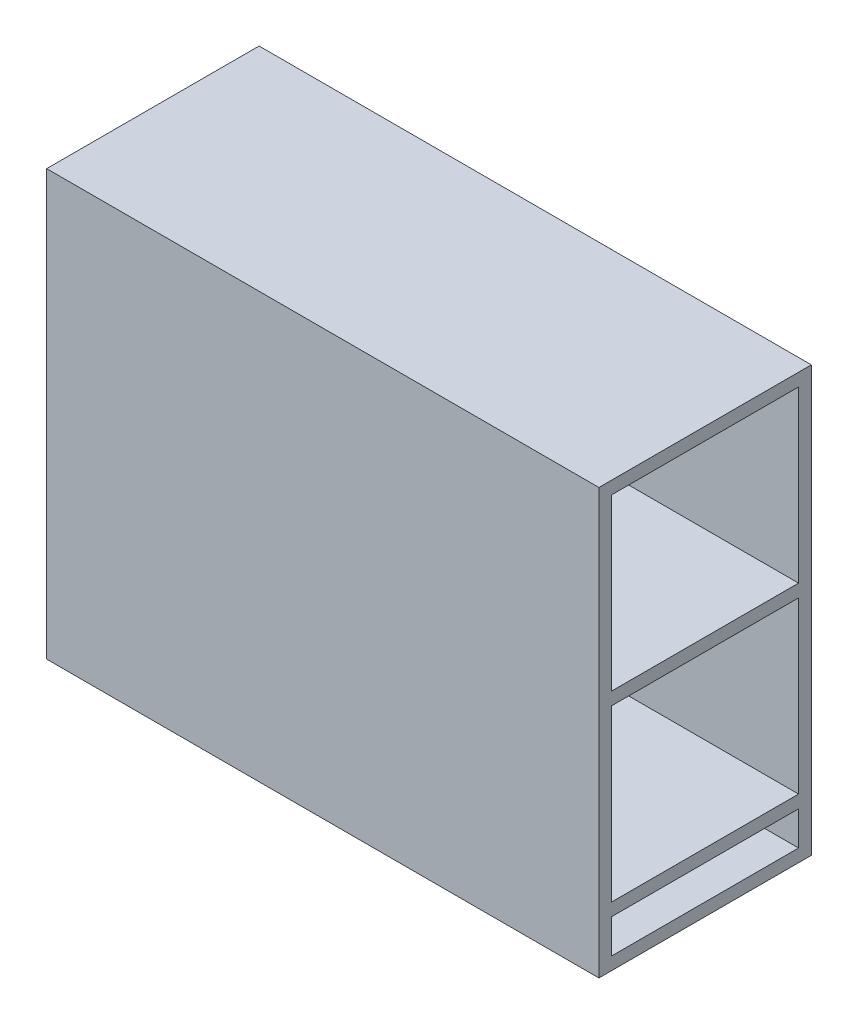
ISO-10303-21;
HEADER;
FILE_DESCRIPTION(('STEP AP214'),'2;1');
FILE_NAME('part.step','',(''),(''),'','','');
FILE_SCHEMA(('AUTOMOTIVE_DESIGN { 1 0 10303 214 1 1 1 1 }'));
ENDSEC;
DATA;
#1=APPLICATION_CONTEXT('core data for automotive mechanical design processes');
#2=APPLICATION_PROTOCOL_DEFINITION('international standard','automotive_design',2000,#1);
#3=PRODUCT_CONTEXT('',#1,'mechanical');
#4=PRODUCT('Part','Part','',(#3));
#5=PRODUCT_RELATED_PRODUCT_CATEGORY('part','',(#4));
#6=PRODUCT_DEFINITION_FORMATION('','',#4);
#7=PRODUCT_DEFINITION_CONTEXT('part definition',#1,'design');
#8=PRODUCT_DEFINITION('design','',#6,#7);
#9=PRODUCT_DEFINITION_SHAPE('','',#8);
#10=(LENGTH_UNIT() NAMED_UNIT(*) SI_UNIT(.MILLI.,.METRE.));
#11=(NAMED_UNIT(*) PLANE_ANGLE_UNIT() SI_UNIT($,.RADIAN.));
#12=(NAMED_UNIT(*) SI_UNIT($,.STERADIAN.) SOLID_ANGLE_UNIT());
#13=UNCERTAINTY_MEASURE_WITH_UNIT(LENGTH_MEASURE(1.E-05),#10,'distance_accuracy_value','');
#14=(GEOMETRIC_REPRESENTATION_CONTEXT(3) GLOBAL_UNCERTAINTY_ASSIGNED_CONTEXT((#13)) GLOBAL_UNIT_ASSIGNED_CONTEXT((#10,
#11,#12)) REPRESENTATION_CONTEXT('',''));
#15=CARTESIAN_POINT('',(0.,0.,0.));
#16=DIRECTION('',(0.,0.,1.));
#17=DIRECTION('',(1.,0.,0.));
#18=AXIS2_PLACEMENT_3D('',#15,#16,#17);
#19=CARTESIAN_POINT('',(0.,100.,0.));
#20=DIRECTION('',(1.,0.,0.));
#21=DIRECTION('',(0.,0.,-1.));
#22=AXIS2_PLACEMENT_3D('',#19,#20,#21);
#23=PLANE('',#22);
#24=DIRECTION('',(0.,0.,1.));
#25=VECTOR('',#24,1.);
#26=CARTESIAN_POINT('',(0.,0.,0.));
#27=LINE('',#26,#25);
#28=CARTESIAN_POINT('',(0.,0.,-50.));
#29=VERTEX_POINT('',#28);
#30=CARTESIAN_POINT('',(0.,0.,0.));
#31=VERTEX_POINT('',#30);
#32=EDGE_CURVE('E244',#29,#31,#27,.T.);
#33=ORIENTED_EDGE('',*,*,#32,.T.);
#34=DIRECTION('',(0.,-1.,0.));
#35=VECTOR('',#34,1.);
#36=CARTESIAN_POINT('',(0.,100.,0.));
#37=LINE('',#36,#35);
#38=CARTESIAN_POINT('',(0.,100.,0.));
#39=VERTEX_POINT('',#38);
#40=EDGE_CURVE('E12',#39,#31,#37,.T.);
#41=ORIENTED_EDGE('',*,*,#40,.F.);
#42=DIRECTION('',(0.,0.,1.));
#43=VECTOR('',#42,1.);
#44=CARTESIAN_POINT('',(0.,100.,0.));
#45=LINE('',#44,#43);
#46=CARTESIAN_POINT('',(0.,100.,-50.));
#47=VERTEX_POINT('',#46);
#48=EDGE_CURVE('E245',#47,#39,#45,.T.);
#49=ORIENTED_EDGE('',*,*,#48,.F.);
#50=DIRECTION('',(0.,-1.,0.));
#51=VECTOR('',#50,1.);
#52=CARTESIAN_POINT('',(0.,100.,-50.));
#53=LINE('',#52,#51);
#54=EDGE_CURVE('E255',#47,#29,#53,.T.);
#55=ORIENTED_EDGE('',*,*,#54,.T.);
#56=EDGE_LOOP('',(#33,#41,#49,#55));
#57=FACE_BOUND('',#56,.T.);
#58=ADVANCED_FACE('F39',(#57),#23,.F.);
#59=CARTESIAN_POINT('',(0.,100.,0.));
#60=DIRECTION('',(0.,0.,-1.));
#61=DIRECTION('',(-1.,0.,0.));
#62=AXIS2_PLACEMENT_3D('',#59,#60,#61);
#63=PLANE('',#62);
#64=DIRECTION('',(1.,0.,0.));
#65=VECTOR('',#64,1.);
#66=CARTESIAN_POINT('',(0.,0.,0.));
#67=LINE('',#66,#65);
#68=CARTESIAN_POINT('',(130.,0.,0.));
#69=VERTEX_POINT('',#68);
#70=EDGE_CURVE('E258',#31,#69,#67,.T.);
#71=ORIENTED_EDGE('',*,*,#70,.T.);
#72=DIRECTION('',(0.,-1.,0.));
#73=VECTOR('',#72,1.);
#74=CARTESIAN_POINT('',(130.,100.,0.));
#75=LINE('',#74,#73);
#76=CARTESIAN_POINT('',(130.,100.,0.));
#77=VERTEX_POINT('',#76);
#78=EDGE_CURVE('E46',#77,#69,#75,.T.);
#79=ORIENTED_EDGE('',*,*,#78,.F.);
#80=DIRECTION('',(1.,0.,0.));
#81=VECTOR('',#80,1.);
#82=CARTESIAN_POINT('',(0.,100.,0.));
#83=LINE('',#82,#81);
#84=EDGE_CURVE('E248',#39,#77,#83,.T.);
#85=ORIENTED_EDGE('',*,*,#84,.F.);
#86=ORIENTED_EDGE('',*,*,#40,.T.);
#87=EDGE_LOOP('',(#71,#79,#85,#86));
#88=FACE_BOUND('',#87,.T.);
#89=ADVANCED_FACE('F288',(#88),#63,.F.);
#90=CARTESIAN_POINT('',(130.,100.,0.));
#91=DIRECTION('',(-1.,0.,0.));
#92=DIRECTION('',(0.,0.,1.));
#93=AXIS2_PLACEMENT_3D('',#90,#91,#92);
#94=PLANE('',#93);
#95=DIRECTION('',(0.,0.,-1.));
#96=VECTOR('',#95,1.);
#97=CARTESIAN_POINT('',(130.,11.,-3.));
#98=LINE('',#97,#96);
#99=CARTESIAN_POINT('',(130.,11.,-3.));
#100=VERTEX_POINT('',#99);
#101=CARTESIAN_POINT('',(130.,11.,-47.));
#102=VERTEX_POINT('',#101);
#103=EDGE_CURVE('E173',#100,#102,#98,.T.);
#104=ORIENTED_EDGE('',*,*,#103,.T.);
#105=DIRECTION('',(0.,-1.,0.));
#106=VECTOR('',#105,1.);
#107=CARTESIAN_POINT('',(130.,100.,-47.));
#108=LINE('',#107,#106);
#109=CARTESIAN_POINT('',(130.,3.,-47.));
#110=VERTEX_POINT('',#109);
#111=EDGE_CURVE('E179',#102,#110,#108,.T.);
#112=ORIENTED_EDGE('',*,*,#111,.T.);
#113=DIRECTION('',(0.,0.,-1.));
#114=VECTOR('',#113,1.);
#115=CARTESIAN_POINT('',(130.,3.,0.));
#116=LINE('',#115,#114);
#117=CARTESIAN_POINT('',(130.,3.,-3.));
#118=VERTEX_POINT('',#117);
#119=EDGE_CURVE('E167',#118,#110,#116,.T.);
#120=ORIENTED_EDGE('',*,*,#119,.F.);
#121=DIRECTION('',(0.,-1.,0.));
#122=VECTOR('',#121,1.);
#123=CARTESIAN_POINT('',(130.,100.,-3.));
#124=LINE('',#123,#122);
#125=EDGE_CURVE('E162',#100,#118,#124,.T.);
#126=ORIENTED_EDGE('',*,*,#125,.F.);
#127=EDGE_LOOP('',(#104,#112,#120,#126));
#128=FACE_BOUND('',#127,.T.);
#129=DIRECTION('',(0.,0.,-1.));
#130=VECTOR('',#129,1.);
#131=CARTESIAN_POINT('',(130.,14.,-3.));
#132=LINE('',#131,#130);
#133=CARTESIAN_POINT('',(130.,14.,-3.));
#134=VERTEX_POINT('',#133);
#135=CARTESIAN_POINT('',(130.,14.,-47.));
#136=VERTEX_POINT('',#135);
#137=EDGE_CURVE('E199',#134,#136,#132,.T.);
#138=ORIENTED_EDGE('',*,*,#137,.F.);
#139=DIRECTION('',(0.,-1.,0.));
#140=VECTOR('',#139,1.);
#141=CARTESIAN_POINT('',(130.,54.,-3.));
#142=LINE('',#141,#140);
#143=CARTESIAN_POINT('',(130.,54.,-3.));
#144=VERTEX_POINT('',#143);
#145=EDGE_CURVE('E61',#144,#134,#142,.T.);
#146=ORIENTED_EDGE('',*,*,#145,.F.);
#147=DIRECTION('',(0.,0.,1.));
#148=VECTOR('',#147,1.);
#149=CARTESIAN_POINT('',(130.,54.,-3.));
#150=LINE('',#149,#148);
#151=CARTESIAN_POINT('',(130.,54.,-47.));
#152=VERTEX_POINT('',#151);
#153=EDGE_CURVE('E205',#152,#144,#150,.T.);
#154=ORIENTED_EDGE('',*,*,#153,.F.);
#155=DIRECTION('',(0.,1.,0.));
#156=VECTOR('',#155,1.);
#157=CARTESIAN_POINT('',(130.,54.,-47.));
#158=LINE('',#157,#156);
#159=EDGE_CURVE('E202',#136,#152,#158,.T.);
#160=ORIENTED_EDGE('',*,*,#159,.F.);
#161=EDGE_LOOP('',(#138,#146,#154,#160));
#162=FACE_BOUND('',#161,.T.);
#163=DIRECTION('',(0.,-1.,0.));
#164=VECTOR('',#163,1.);
#165=CARTESIAN_POINT('',(130.,97.,-3.));
#166=LINE('',#165,#164);
#167=CARTESIAN_POINT('',(130.,97.,-3.));
#168=VERTEX_POINT('',#167);
#169=CARTESIAN_POINT('',(130.,57.,-3.));
#170=VERTEX_POINT('',#169);
#171=EDGE_CURVE('E226',#168,#170,#166,.T.);
#172=ORIENTED_EDGE('',*,*,#171,.F.);
#173=DIRECTION('',(0.,0.,1.));
#174=VECTOR('',#173,1.);
#175=CARTESIAN_POINT('',(130.,97.,-3.));
#176=LINE('',#175,#174);
#177=CARTESIAN_POINT('',(130.,97.,-47.));
#178=VERTEX_POINT('',#177);
#179=EDGE_CURVE('E216',#178,#168,#176,.T.);
#180=ORIENTED_EDGE('',*,*,#179,.F.);
#181=DIRECTION('',(0.,1.,0.));
#182=VECTOR('',#181,1.);
#183=CARTESIAN_POINT('',(130.,97.,-47.));
#184=LINE('',#183,#182);
#185=CARTESIAN_POINT('',(130.,57.,-47.));
#186=VERTEX_POINT('',#185);
#187=EDGE_CURVE('E232',#186,#178,#184,.T.);
#188=ORIENTED_EDGE('',*,*,#187,.F.);
#189=DIRECTION('',(0.,0.,-1.));
#190=VECTOR('',#189,1.);
#191=CARTESIAN_POINT('',(130.,57.,-3.));
#192=LINE('',#191,#190);
#193=EDGE_CURVE('E229',#170,#186,#192,.T.);
#194=ORIENTED_EDGE('',*,*,#193,.F.);
#195=EDGE_LOOP('',(#172,#180,#188,#194));
#196=FACE_BOUND('',#195,.T.);
#197=DIRECTION('',(0.,0.,-1.));
#198=VECTOR('',#197,1.);
#199=CARTESIAN_POINT('',(130.,0.,0.));
#200=LINE('',#199,#198);
#201=CARTESIAN_POINT('',(130.,0.,-50.));
#202=VERTEX_POINT('',#201);
#203=EDGE_CURVE('E260',#69,#202,#200,.T.);
#204=ORIENTED_EDGE('',*,*,#203,.T.);
#205=DIRECTION('',(0.,-1.,0.));
#206=VECTOR('',#205,1.);
#207=CARTESIAN_POINT('',(130.,100.,-50.));
#208=LINE('',#207,#206);
#209=CARTESIAN_POINT('',(130.,100.,-50.));
#210=VERTEX_POINT('',#209);
#211=EDGE_CURVE('E265',#210,#202,#208,.T.);
#212=ORIENTED_EDGE('',*,*,#211,.F.);
#213=DIRECTION('',(0.,0.,-1.));
#214=VECTOR('',#213,1.);
#215=CARTESIAN_POINT('',(130.,100.,0.));
#216=LINE('',#215,#214);
#217=EDGE_CURVE('E251',#77,#210,#216,.T.);
#218=ORIENTED_EDGE('',*,*,#217,.F.);
#219=ORIENTED_EDGE('',*,*,#78,.T.);
#220=EDGE_LOOP('',(#204,#212,#218,#219));
#221=FACE_BOUND('',#220,.T.);
#222=ADVANCED_FACE('F272',(#128,#162,#196,#221),#94,.F.);
#223=CARTESIAN_POINT('',(0.,100.,-50.));
#224=DIRECTION('',(0.,0.,1.));
#225=DIRECTION('',(1.,0.,0.));
#226=AXIS2_PLACEMENT_3D('',#223,#224,#225);
#227=PLANE('',#226);
#228=DIRECTION('',(-1.,0.,0.));
#229=VECTOR('',#228,1.);
#230=CARTESIAN_POINT('',(0.,0.,-50.));
#231=LINE('',#230,#229);
#232=EDGE_CURVE('E249',#202,#29,#231,.T.);
#233=ORIENTED_EDGE('',*,*,#232,.T.);
#234=ORIENTED_EDGE('',*,*,#54,.F.);
#235=DIRECTION('',(-1.,0.,0.));
#236=VECTOR('',#235,1.);
#237=CARTESIAN_POINT('',(0.,100.,-50.));
#238=LINE('',#237,#236);
#239=EDGE_CURVE('E253',#210,#47,#238,.T.);
#240=ORIENTED_EDGE('',*,*,#239,.F.);
#241=ORIENTED_EDGE('',*,*,#211,.T.);
#242=EDGE_LOOP('',(#233,#234,#240,#241));
#243=FACE_BOUND('',#242,.T.);
#244=ADVANCED_FACE('F281',(#243),#227,.F.);
#245=CARTESIAN_POINT('',(0.,100.,0.));
#246=DIRECTION('',(0.,-1.,0.));
#247=DIRECTION('',(0.,0.,-1.));
#248=AXIS2_PLACEMENT_3D('',#245,#246,#247);
#249=PLANE('',#248);
#250=ORIENTED_EDGE('',*,*,#48,.T.);
#251=ORIENTED_EDGE('',*,*,#84,.T.);
#252=ORIENTED_EDGE('',*,*,#217,.T.);
#253=ORIENTED_EDGE('',*,*,#239,.T.);
#254=EDGE_LOOP('',(#250,#251,#252,#253));
#255=FACE_BOUND('',#254,.T.);
#256=ADVANCED_FACE('F287',(#255),#249,.F.);
#257=CARTESIAN_POINT('',(0.,0.,0.));
#258=DIRECTION('',(0.,-1.,0.));
#259=DIRECTION('',(0.,0.,-1.));
#260=AXIS2_PLACEMENT_3D('',#257,#258,#259);
#261=PLANE('',#260);
#262=ORIENTED_EDGE('',*,*,#32,.F.);
#263=ORIENTED_EDGE('',*,*,#232,.F.);
#264=ORIENTED_EDGE('',*,*,#203,.F.);
#265=ORIENTED_EDGE('',*,*,#70,.F.);
#266=EDGE_LOOP('',(#262,#263,#264,#265));
#267=FACE_BOUND('',#266,.T.);
#268=ADVANCED_FACE('F278',(#267),#261,.T.);
#269=CARTESIAN_POINT('',(-59.464274989274,97.,-3.));
#270=DIRECTION('',(0.,1.,0.));
#271=DIRECTION('',(0.,0.,1.));
#272=AXIS2_PLACEMENT_3D('',#269,#270,#271);
#273=PLANE('',#272);
#274=DIRECTION('',(0.,0.,-1.));
#275=VECTOR('',#274,1.);
#276=CARTESIAN_POINT('',(3.,97.,-3.));
#277=LINE('',#276,#275);
#278=CARTESIAN_POINT('',(3.,97.,-3.));
#279=VERTEX_POINT('',#278);
#280=CARTESIAN_POINT('',(3.,97.,-47.));
#281=VERTEX_POINT('',#280);
#282=EDGE_CURVE('E222',#279,#281,#277,.T.);
#283=ORIENTED_EDGE('',*,*,#282,.T.);
#284=DIRECTION('',(1.,0.,0.));
#285=VECTOR('',#284,1.);
#286=CARTESIAN_POINT('',(-59.464274989274,97.,-47.));
#287=LINE('',#286,#285);
#288=EDGE_CURVE('E220',#281,#178,#287,.T.);
#289=ORIENTED_EDGE('',*,*,#288,.T.);
#290=ORIENTED_EDGE('',*,*,#179,.T.);
#291=DIRECTION('',(1.,0.,0.));
#292=VECTOR('',#291,1.);
#293=CARTESIAN_POINT('',(-59.464274989274,97.,-3.));
#294=LINE('',#293,#292);
#295=EDGE_CURVE('E235',#279,#168,#294,.T.);
#296=ORIENTED_EDGE('',*,*,#295,.F.);
#297=EDGE_LOOP('',(#283,#289,#290,#296));
#298=FACE_BOUND('',#297,.T.);
#299=ADVANCED_FACE('F301',(#298),#273,.F.);
#300=CARTESIAN_POINT('',(-59.464274989274,97.,-47.));
#301=DIRECTION('',(0.,0.,-1.));
#302=DIRECTION('',(-1.,0.,0.));
#303=AXIS2_PLACEMENT_3D('',#300,#301,#302);
#304=PLANE('',#303);
#305=DIRECTION('',(0.,-1.,0.));
#306=VECTOR('',#305,1.);
#307=CARTESIAN_POINT('',(3.,97.,-47.));
#308=LINE('',#307,#306);
#309=CARTESIAN_POINT('',(3.,57.,-47.));
#310=VERTEX_POINT('',#309);
#311=EDGE_CURVE('E219',#281,#310,#308,.T.);
#312=ORIENTED_EDGE('',*,*,#311,.T.);
#313=DIRECTION('',(1.,0.,0.));
#314=VECTOR('',#313,1.);
#315=CARTESIAN_POINT('',(-59.464274989274,57.,-47.));
#316=LINE('',#315,#314);
#317=EDGE_CURVE('E237',#310,#186,#316,.T.);
#318=ORIENTED_EDGE('',*,*,#317,.T.);
#319=ORIENTED_EDGE('',*,*,#187,.T.);
#320=ORIENTED_EDGE('',*,*,#288,.F.);
#321=EDGE_LOOP('',(#312,#318,#319,#320));
#322=FACE_BOUND('',#321,.T.);
#323=ADVANCED_FACE('F306',(#322),#304,.F.);
#324=CARTESIAN_POINT('',(-59.464274989274,57.,-3.));
#325=DIRECTION('',(0.,-1.,0.));
#326=DIRECTION('',(0.,0.,-1.));
#327=AXIS2_PLACEMENT_3D('',#324,#325,#326);
#328=PLANE('',#327);
#329=DIRECTION('',(0.,0.,1.));
#330=VECTOR('',#329,1.);
#331=CARTESIAN_POINT('',(3.,57.,-3.));
#332=LINE('',#331,#330);
#333=CARTESIAN_POINT('',(3.,57.,-3.));
#334=VERTEX_POINT('',#333);
#335=EDGE_CURVE('E217',#310,#334,#332,.T.);
#336=ORIENTED_EDGE('',*,*,#335,.T.);
#337=DIRECTION('',(1.,0.,0.));
#338=VECTOR('',#337,1.);
#339=CARTESIAN_POINT('',(-59.464274989274,57.,-3.));
#340=LINE('',#339,#338);
#341=EDGE_CURVE('E239',#334,#170,#340,.T.);
#342=ORIENTED_EDGE('',*,*,#341,.T.);
#343=ORIENTED_EDGE('',*,*,#193,.T.);
#344=ORIENTED_EDGE('',*,*,#317,.F.);
#345=EDGE_LOOP('',(#336,#342,#343,#344));
#346=FACE_BOUND('',#345,.T.);
#347=ADVANCED_FACE('F312',(#346),#328,.F.);
#348=CARTESIAN_POINT('',(-59.464274989274,97.,-3.));
#349=DIRECTION('',(0.,0.,1.));
#350=DIRECTION('',(1.,0.,0.));
#351=AXIS2_PLACEMENT_3D('',#348,#349,#350);
#352=PLANE('',#351);
#353=DIRECTION('',(0.,1.,0.));
#354=VECTOR('',#353,1.);
#355=CARTESIAN_POINT('',(3.,97.,-3.));
#356=LINE('',#355,#354);
#357=EDGE_CURVE('E224',#334,#279,#356,.T.);
#358=ORIENTED_EDGE('',*,*,#357,.T.);
#359=ORIENTED_EDGE('',*,*,#295,.T.);
#360=ORIENTED_EDGE('',*,*,#171,.T.);
#361=ORIENTED_EDGE('',*,*,#341,.F.);
#362=EDGE_LOOP('',(#358,#359,#360,#361));
#363=FACE_BOUND('',#362,.T.);
#364=ADVANCED_FACE('F308',(#363),#352,.F.);
#365=CARTESIAN_POINT('',(3.,100.,0.));
#366=DIRECTION('',(1.,0.,0.));
#367=DIRECTION('',(0.,0.,-1.));
#368=AXIS2_PLACEMENT_3D('',#365,#366,#367);
#369=PLANE('',#368);
#370=ORIENTED_EDGE('',*,*,#282,.F.);
#371=ORIENTED_EDGE('',*,*,#357,.F.);
#372=ORIENTED_EDGE('',*,*,#335,.F.);
#373=ORIENTED_EDGE('',*,*,#311,.F.);
#374=EDGE_LOOP('',(#370,#371,#372,#373));
#375=FACE_BOUND('',#374,.T.);
#376=ADVANCED_FACE('F311',(#375),#369,.T.);
#377=CARTESIAN_POINT('',(-59.464274989274,54.,-3.));
#378=DIRECTION('',(0.,0.,1.));
#379=DIRECTION('',(0.,-1.,0.));
#380=AXIS2_PLACEMENT_3D('',#377,#378,#379);
#381=PLANE('',#380);
#382=DIRECTION('',(0.,1.,0.));
#383=VECTOR('',#382,1.);
#384=CARTESIAN_POINT('',(3.,54.,-3.));
#385=LINE('',#384,#383);
#386=CARTESIAN_POINT('',(3.,14.,-3.));
#387=VERTEX_POINT('',#386);
#388=CARTESIAN_POINT('',(3.,54.,-3.));
#389=VERTEX_POINT('',#388);
#390=EDGE_CURVE('E195',#387,#389,#385,.T.);
#391=ORIENTED_EDGE('',*,*,#390,.T.);
#392=DIRECTION('',(1.,0.,0.));
#393=VECTOR('',#392,1.);
#394=CARTESIAN_POINT('',(-59.464274989274,54.,-3.));
#395=LINE('',#394,#393);
#396=EDGE_CURVE('E193',#389,#144,#395,.T.);
#397=ORIENTED_EDGE('',*,*,#396,.T.);
#398=ORIENTED_EDGE('',*,*,#145,.T.);
#399=DIRECTION('',(1.,0.,0.));
#400=VECTOR('',#399,1.);
#401=CARTESIAN_POINT('',(-59.464274989274,14.,-3.));
#402=LINE('',#401,#400);
#403=EDGE_CURVE('E208',#387,#134,#402,.T.);
#404=ORIENTED_EDGE('',*,*,#403,.F.);
#405=EDGE_LOOP('',(#391,#397,#398,#404));
#406=FACE_BOUND('',#405,.T.);
#407=ADVANCED_FACE('F322',(#406),#381,.F.);
#408=CARTESIAN_POINT('',(-59.464274989274,54.,-3.));
#409=DIRECTION('',(0.,1.,0.));
#410=DIRECTION('',(0.,0.,1.));
#411=AXIS2_PLACEMENT_3D('',#408,#409,#410);
#412=PLANE('',#411);
#413=DIRECTION('',(0.,0.,-1.));
#414=VECTOR('',#413,1.);
#415=CARTESIAN_POINT('',(3.,54.,-3.));
#416=LINE('',#415,#414);
#417=CARTESIAN_POINT('',(3.,54.,-47.));
#418=VERTEX_POINT('',#417);
#419=EDGE_CURVE('E192',#389,#418,#416,.T.);
#420=ORIENTED_EDGE('',*,*,#419,.T.);
#421=DIRECTION('',(1.,0.,0.));
#422=VECTOR('',#421,1.);
#423=CARTESIAN_POINT('',(-59.464274989274,54.,-47.));
#424=LINE('',#423,#422);
#425=EDGE_CURVE('E210',#418,#152,#424,.T.);
#426=ORIENTED_EDGE('',*,*,#425,.T.);
#427=ORIENTED_EDGE('',*,*,#153,.T.);
#428=ORIENTED_EDGE('',*,*,#396,.F.);
#429=EDGE_LOOP('',(#420,#426,#427,#428));
#430=FACE_BOUND('',#429,.T.);
#431=ADVANCED_FACE('F326',(#430),#412,.F.);
#432=CARTESIAN_POINT('',(-59.464274989274,54.,-47.));
#433=DIRECTION('',(0.,0.,-1.));
#434=DIRECTION('',(-1.,0.,0.));
#435=AXIS2_PLACEMENT_3D('',#432,#433,#434);
#436=PLANE('',#435);
#437=DIRECTION('',(0.,-1.,0.));
#438=VECTOR('',#437,1.);
#439=CARTESIAN_POINT('',(3.,54.,-47.));
#440=LINE('',#439,#438);
#441=CARTESIAN_POINT('',(3.,14.,-47.));
#442=VERTEX_POINT('',#441);
#443=EDGE_CURVE('E190',#418,#442,#440,.T.);
#444=ORIENTED_EDGE('',*,*,#443,.T.);
#445=DIRECTION('',(1.,0.,0.));
#446=VECTOR('',#445,1.);
#447=CARTESIAN_POINT('',(-59.464274989274,14.,-47.));
#448=LINE('',#447,#446);
#449=EDGE_CURVE('E212',#442,#136,#448,.T.);
#450=ORIENTED_EDGE('',*,*,#449,.T.);
#451=ORIENTED_EDGE('',*,*,#159,.T.);
#452=ORIENTED_EDGE('',*,*,#425,.F.);
#453=EDGE_LOOP('',(#444,#450,#451,#452));
#454=FACE_BOUND('',#453,.T.);
#455=ADVANCED_FACE('F331',(#454),#436,.F.);
#456=CARTESIAN_POINT('',(-59.464274989274,14.,-3.));
#457=DIRECTION('',(0.,-1.,0.));
#458=DIRECTION('',(0.,0.,-1.));
#459=AXIS2_PLACEMENT_3D('',#456,#457,#458);
#460=PLANE('',#459);
#461=DIRECTION('',(0.,0.,1.));
#462=VECTOR('',#461,1.);
#463=CARTESIAN_POINT('',(3.,14.,-3.));
#464=LINE('',#463,#462);
#465=EDGE_CURVE('E197',#442,#387,#464,.T.);
#466=ORIENTED_EDGE('',*,*,#465,.T.);
#467=ORIENTED_EDGE('',*,*,#403,.T.);
#468=ORIENTED_EDGE('',*,*,#137,.T.);
#469=ORIENTED_EDGE('',*,*,#449,.F.);
#470=EDGE_LOOP('',(#466,#467,#468,#469));
#471=FACE_BOUND('',#470,.T.);
#472=ADVANCED_FACE('F327',(#471),#460,.F.);
#473=CARTESIAN_POINT('',(3.,100.,0.));
#474=DIRECTION('',(1.,0.,0.));
#475=DIRECTION('',(0.,0.,-1.));
#476=AXIS2_PLACEMENT_3D('',#473,#474,#475);
#477=PLANE('',#476);
#478=ORIENTED_EDGE('',*,*,#390,.F.);
#479=ORIENTED_EDGE('',*,*,#465,.F.);
#480=ORIENTED_EDGE('',*,*,#443,.F.);
#481=ORIENTED_EDGE('',*,*,#419,.F.);
#482=EDGE_LOOP('',(#478,#479,#480,#481));
#483=FACE_BOUND('',#482,.T.);
#484=ADVANCED_FACE('F330',(#483),#477,.T.);
#485=CARTESIAN_POINT('',(3.,100.,0.));
#486=DIRECTION('',(1.,0.,0.));
#487=DIRECTION('',(0.,0.,-1.));
#488=AXIS2_PLACEMENT_3D('',#485,#486,#487);
#489=PLANE('',#488);
#490=DIRECTION('',(0.,0.,1.));
#491=VECTOR('',#490,1.);
#492=CARTESIAN_POINT('',(3.,11.,-3.));
#493=LINE('',#492,#491);
#494=CARTESIAN_POINT('',(3.,11.,-47.));
#495=VERTEX_POINT('',#494);
#496=CARTESIAN_POINT('',(3.,11.,-3.));
#497=VERTEX_POINT('',#496);
#498=EDGE_CURVE('E159',#495,#497,#493,.T.);
#499=ORIENTED_EDGE('',*,*,#498,.T.);
#500=DIRECTION('',(0.,-1.,0.));
#501=VECTOR('',#500,1.);
#502=CARTESIAN_POINT('',(3.,100.,-3.));
#503=LINE('',#502,#501);
#504=CARTESIAN_POINT('',(3.,3.,-3.));
#505=VERTEX_POINT('',#504);
#506=EDGE_CURVE('E154',#497,#505,#503,.T.);
#507=ORIENTED_EDGE('',*,*,#506,.T.);
#508=DIRECTION('',(0.,0.,1.));
#509=VECTOR('',#508,1.);
#510=CARTESIAN_POINT('',(3.,3.,0.));
#511=LINE('',#510,#509);
#512=CARTESIAN_POINT('',(3.,3.,-47.));
#513=VERTEX_POINT('',#512);
#514=EDGE_CURVE('E157',#513,#505,#511,.T.);
#515=ORIENTED_EDGE('',*,*,#514,.F.);
#516=DIRECTION('',(0.,-1.,0.));
#517=VECTOR('',#516,1.);
#518=CARTESIAN_POINT('',(3.,100.,-47.));
#519=LINE('',#518,#517);
#520=EDGE_CURVE('E178',#495,#513,#519,.T.);
#521=ORIENTED_EDGE('',*,*,#520,.F.);
#522=EDGE_LOOP('',(#499,#507,#515,#521));
#523=FACE_BOUND('',#522,.T.);
#524=ADVANCED_FACE('F155',(#523),#489,.T.);
#525=CARTESIAN_POINT('',(0.,100.,-3.));
#526=DIRECTION('',(0.,0.,-1.));
#527=DIRECTION('',(-1.,0.,0.));
#528=AXIS2_PLACEMENT_3D('',#525,#526,#527);
#529=PLANE('',#528);
#530=ORIENTED_EDGE('',*,*,#125,.T.);
#531=DIRECTION('',(1.,0.,0.));
#532=VECTOR('',#531,1.);
#533=CARTESIAN_POINT('',(0.,3.,-3.));
#534=LINE('',#533,#532);
#535=EDGE_CURVE('E53',#505,#118,#534,.T.);
#536=ORIENTED_EDGE('',*,*,#535,.F.);
#537=ORIENTED_EDGE('',*,*,#506,.F.);
#538=DIRECTION('',(-1.,0.,0.));
#539=VECTOR('',#538,1.);
#540=CARTESIAN_POINT('',(0.,11.,-3.));
#541=LINE('',#540,#539);
#542=EDGE_CURVE('E187',#100,#497,#541,.T.);
#543=ORIENTED_EDGE('',*,*,#542,.F.);
#544=EDGE_LOOP('',(#530,#536,#537,#543));
#545=FACE_BOUND('',#544,.T.);
#546=ADVANCED_FACE('F164',(#545),#529,.T.);
#547=CARTESIAN_POINT('',(0.,100.,-47.));
#548=DIRECTION('',(0.,0.,1.));
#549=DIRECTION('',(1.,0.,0.));
#550=AXIS2_PLACEMENT_3D('',#547,#548,#549);
#551=PLANE('',#550);
#552=DIRECTION('',(-1.,0.,0.));
#553=VECTOR('',#552,1.);
#554=CARTESIAN_POINT('',(-59.464274989274,11.,-47.));
#555=LINE('',#554,#553);
#556=EDGE_CURVE('E161',#102,#495,#555,.T.);
#557=ORIENTED_EDGE('',*,*,#556,.T.);
#558=ORIENTED_EDGE('',*,*,#520,.T.);
#559=DIRECTION('',(-1.,0.,0.));
#560=VECTOR('',#559,1.);
#561=CARTESIAN_POINT('',(0.,3.,-47.));
#562=LINE('',#561,#560);
#563=EDGE_CURVE('E172',#110,#513,#562,.T.);
#564=ORIENTED_EDGE('',*,*,#563,.F.);
#565=ORIENTED_EDGE('',*,*,#111,.F.);
#566=EDGE_LOOP('',(#557,#558,#564,#565));
#567=FACE_BOUND('',#566,.T.);
#568=ADVANCED_FACE('F348',(#567),#551,.T.);
#569=CARTESIAN_POINT('',(0.,3.,0.));
#570=DIRECTION('',(0.,-1.,0.));
#571=DIRECTION('',(0.,0.,-1.));
#572=AXIS2_PLACEMENT_3D('',#569,#570,#571);
#573=PLANE('',#572);
#574=ORIENTED_EDGE('',*,*,#514,.T.);
#575=ORIENTED_EDGE('',*,*,#535,.T.);
#576=ORIENTED_EDGE('',*,*,#119,.T.);
#577=ORIENTED_EDGE('',*,*,#563,.T.);
#578=EDGE_LOOP('',(#574,#575,#576,#577));
#579=FACE_BOUND('',#578,.T.);
#580=ADVANCED_FACE('F170',(#579),#573,.F.);
#581=CARTESIAN_POINT('',(-59.464274989274,11.,-3.));
#582=DIRECTION('',(0.,-1.,0.));
#583=DIRECTION('',(0.,0.,-1.));
#584=AXIS2_PLACEMENT_3D('',#581,#582,#583);
#585=PLANE('',#584);
#586=ORIENTED_EDGE('',*,*,#556,.F.);
#587=ORIENTED_EDGE('',*,*,#103,.F.);
#588=ORIENTED_EDGE('',*,*,#542,.T.);
#589=ORIENTED_EDGE('',*,*,#498,.F.);
#590=EDGE_LOOP('',(#586,#587,#588,#589));
#591=FACE_BOUND('',#590,.T.);
#592=ADVANCED_FACE('F342',(#591),#585,.T.);
#593=CLOSED_SHELL('',(#58,#89,#222,#244,#256,#268,#299,#323,#347,#364,#376,#407,#431,#455,#472,
#484,#524,#546,#568,#580,#592));
#594=MANIFOLD_SOLID_BREP('B2',#593);
#595=ADVANCED_BREP_SHAPE_REPRESENTATION('',(#18,#594),#14);
#596=SHAPE_DEFINITION_REPRESENTATION(#9,#595);
ENDSEC;
END-ISO-10303-21;
